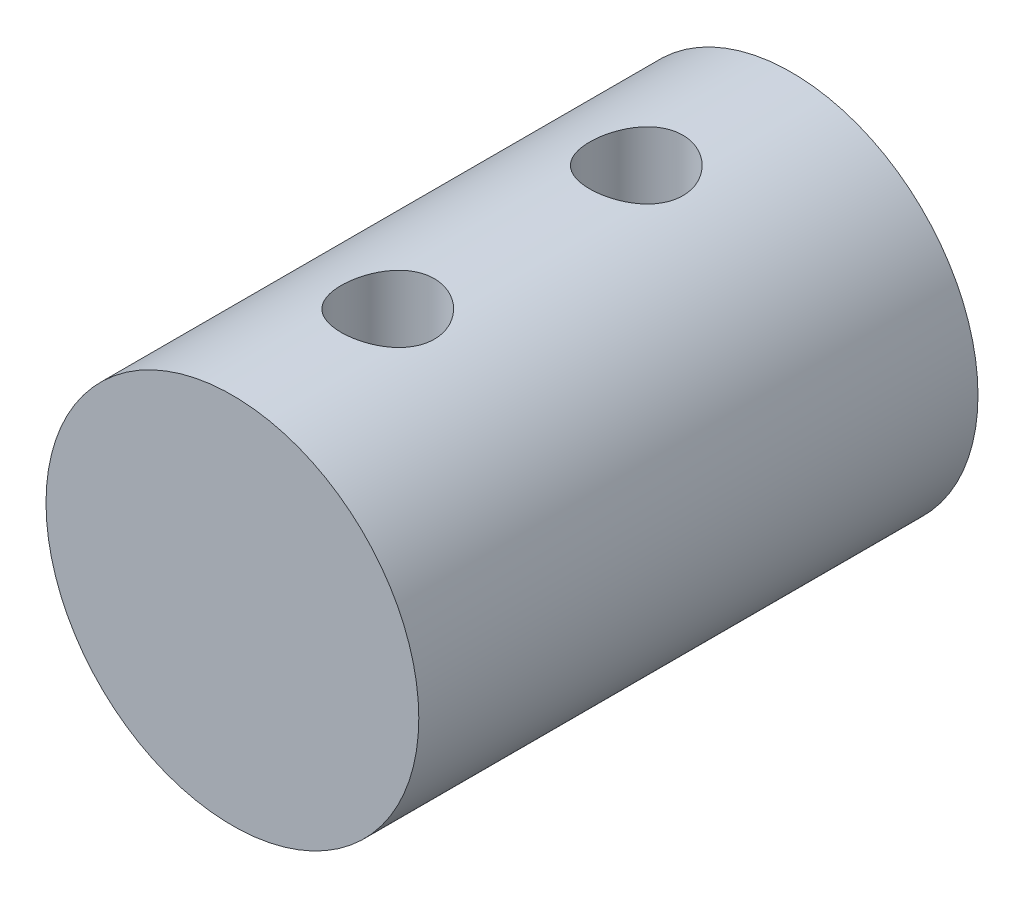
ISO-10303-21;
HEADER;
FILE_DESCRIPTION(('STEP AP214'),'2;1');
FILE_NAME('part.step','',(''),(''),'','','');
FILE_SCHEMA(('AUTOMOTIVE_DESIGN { 1 0 10303 214 1 1 1 1 }'));
ENDSEC;
DATA;
#1=APPLICATION_CONTEXT('core data for automotive mechanical design processes');
#2=APPLICATION_PROTOCOL_DEFINITION('international standard','automotive_design',2000,#1);
#3=PRODUCT_CONTEXT('',#1,'mechanical');
#4=PRODUCT('Part','Part','',(#3));
#5=PRODUCT_RELATED_PRODUCT_CATEGORY('part','',(#4));
#6=PRODUCT_DEFINITION_FORMATION('','',#4);
#7=PRODUCT_DEFINITION_CONTEXT('part definition',#1,'design');
#8=PRODUCT_DEFINITION('design','',#6,#7);
#9=PRODUCT_DEFINITION_SHAPE('','',#8);
#10=(LENGTH_UNIT() NAMED_UNIT(*) SI_UNIT(.MILLI.,.METRE.));
#11=(NAMED_UNIT(*) PLANE_ANGLE_UNIT() SI_UNIT($,.RADIAN.));
#12=(NAMED_UNIT(*) SI_UNIT($,.STERADIAN.) SOLID_ANGLE_UNIT());
#13=UNCERTAINTY_MEASURE_WITH_UNIT(LENGTH_MEASURE(1.E-05),#10,'distance_accuracy_value','');
#14=(GEOMETRIC_REPRESENTATION_CONTEXT(3) GLOBAL_UNCERTAINTY_ASSIGNED_CONTEXT((#13)) GLOBAL_UNIT_ASSIGNED_CONTEXT((#10,
#11,#12)) REPRESENTATION_CONTEXT('',''));
#15=CARTESIAN_POINT('',(0.,0.,0.));
#16=DIRECTION('',(0.,0.,1.));
#17=DIRECTION('',(1.,0.,0.));
#18=AXIS2_PLACEMENT_3D('',#15,#16,#17);
#19=CARTESIAN_POINT('',(0.,0.,18.));
#20=DIRECTION('',(0.,0.,-1.));
#21=DIRECTION('',(-1.,0.,0.));
#22=AXIS2_PLACEMENT_3D('',#19,#20,#21);
#23=CYLINDRICAL_SURFACE('',#22,6.);
#24=CARTESIAN_POINT('',(0.,-6.,14.5));
#25=CARTESIAN_POINT('',(0.0828760886697311,-5.99999859868013,14.4999976742618));
#26=CARTESIAN_POINT('',(0.165778157830763,-5.99826578131828,14.4931084492262));
#27=CARTESIAN_POINT('',(0.329206323770533,-5.99152113829892,14.465774848693));
#28=CARTESIAN_POINT('',(0.409731046870739,-5.98650745419968,14.4453227904621));
#29=CARTESIAN_POINT('',(0.566020872182577,-5.9737562633204,14.3915607465379));
#30=CARTESIAN_POINT('',(0.641791563430003,-5.96602202842087,14.3582662012847));
#31=CARTESIAN_POINT('',(0.786672131904427,-5.94865343807593,14.2798186099552));
#32=CARTESIAN_POINT('',(0.855781784348759,-5.9390190185405,14.2346651638811));
#33=CARTESIAN_POINT('',(0.98680192730092,-5.91867413591801,14.1327992103458));
#34=CARTESIAN_POINT('',(1.04855569006107,-5.90794707148533,14.0758884250408));
#35=CARTESIAN_POINT('',(1.1617489272033,-5.88673620117529,13.9525477950911));
#36=CARTESIAN_POINT('',(1.21318723694914,-5.87625242288348,13.8861168770535));
#37=CARTESIAN_POINT('',(1.30502654279903,-5.8565477569971,13.7444047732626));
#38=CARTESIAN_POINT('',(1.34525221592536,-5.84734794470605,13.6690067691896));
#39=CARTESIAN_POINT('',(1.41239690855053,-5.83149494812223,13.5122515883416));
#40=CARTESIAN_POINT('',(1.43931805543933,-5.82484135672789,13.4308953666742));
#41=CARTESIAN_POINT('',(1.47855483680429,-5.81500476717551,13.2662565017975));
#42=CARTESIAN_POINT('',(1.49115226833334,-5.81175491075426,13.1830451039502));
#43=CARTESIAN_POINT('',(1.50226177506785,-5.80889362537741,13.015631430986));
#44=CARTESIAN_POINT('',(1.50077614181798,-5.80928160448644,12.9314293193014));
#45=CARTESIAN_POINT('',(1.48398652463928,-5.81359205496618,12.7665841922555));
#46=CARTESIAN_POINT('',(1.46901834019052,-5.81742863001879,12.6859043785349));
#47=CARTESIAN_POINT('',(1.42622418690311,-5.82806709676483,12.5282389490887));
#48=CARTESIAN_POINT('',(1.39839730206942,-5.83486919970696,12.451253596971));
#49=CARTESIAN_POINT('',(1.33038947793715,-5.85075113904186,12.3022619837479));
#50=CARTESIAN_POINT('',(1.29008666723291,-5.85985327469421,12.2303138282104));
#51=CARTESIAN_POINT('',(1.19835627601495,-5.87929710846386,12.0940812902432));
#52=CARTESIAN_POINT('',(1.14692674880884,-5.88963902334735,12.0297982519327));
#53=CARTESIAN_POINT('',(1.03266342468122,-5.91075880539781,11.9087963843056));
#54=CARTESIAN_POINT('',(0.969546258165859,-5.92154069477971,11.8523455099386));
#55=CARTESIAN_POINT('',(0.8346119175037,-5.94205965578786,11.7507787575361));
#56=CARTESIAN_POINT('',(0.762794477707943,-5.95179669549415,11.7056632257364));
#57=CARTESIAN_POINT('',(0.612115888681391,-5.96917732094182,11.6279494137756));
#58=CARTESIAN_POINT('',(0.533231393208623,-5.97681360127725,11.5953946597456));
#59=CARTESIAN_POINT('',(0.370876008142882,-5.98907916991418,11.5440826942904));
#60=CARTESIAN_POINT('',(0.287405999150484,-5.99370903339281,11.5253228435819));
#61=CARTESIAN_POINT('',(0.120539970390026,-5.99935499271374,11.5025424344412));
#62=CARTESIAN_POINT('',(0.0371967199882093,-6.00046053508279,11.4981569739247));
#63=CARTESIAN_POINT('',(-0.129032874801509,-5.99918804814451,11.5032490020555));
#64=CARTESIAN_POINT('',(-0.211919259644595,-5.99681033241846,11.5127252427991));
#65=CARTESIAN_POINT('',(-0.373614268776492,-5.98889581127357,11.5449709083914));
#66=CARTESIAN_POINT('',(-0.452465118968754,-5.98340634185811,11.567541263477));
#67=CARTESIAN_POINT('',(-0.605257292452511,-5.96988706634134,11.6251070840284));
#68=CARTESIAN_POINT('',(-0.679198119032635,-5.96185700369892,11.6601038043132));
#69=CARTESIAN_POINT('',(-0.821523134429848,-5.9439330792631,11.7422361288747));
#70=CARTESIAN_POINT('',(-0.889785441835831,-5.93400867366932,11.7895761123968));
#71=CARTESIAN_POINT('',(-1.01752661364325,-5.91344509187419,11.894789908797));
#72=CARTESIAN_POINT('',(-1.07700395897301,-5.90280579251705,11.9526655396169));
#73=CARTESIAN_POINT('',(-1.18699056807273,-5.88168956960771,12.0790019608445));
#74=CARTESIAN_POINT('',(-1.23724386762203,-5.87122304187281,12.1476877030024));
#75=CARTESIAN_POINT('',(-1.3255107590127,-5.85192878377239,12.2927326344657));
#76=CARTESIAN_POINT('',(-1.36352489415794,-5.84310098067026,12.3690914829598));
#77=CARTESIAN_POINT('',(-1.42595142060929,-5.82818094734665,12.5269057224131));
#78=CARTESIAN_POINT('',(-1.45044439665407,-5.82207255291905,12.608327628344));
#79=CARTESIAN_POINT('',(-1.48534565995378,-5.81326744090183,12.7743096378891));
#80=CARTESIAN_POINT('',(-1.49575702747866,-5.81056997719936,12.8588690510325));
#81=CARTESIAN_POINT('',(-1.50203859033399,-5.80894901203957,13.0261210238552));
#82=CARTESIAN_POINT('',(-1.49831789778012,-5.80991932728264,13.1087974351247));
#83=CARTESIAN_POINT('',(-1.47737727831287,-5.81527909007843,13.272303888668));
#84=CARTESIAN_POINT('',(-1.46015762268677,-5.81966846891857,13.3531339680136));
#85=CARTESIAN_POINT('',(-1.41293131944279,-5.83131260682722,13.5102084590654));
#86=CARTESIAN_POINT('',(-1.38300140468038,-5.83855015236309,13.5864773052402));
#87=CARTESIAN_POINT('',(-1.31126491360507,-5.85507755724829,13.7329653827137));
#88=CARTESIAN_POINT('',(-1.26945669003419,-5.86436770120773,13.8031837731869));
#89=CARTESIAN_POINT('',(-1.17386774863714,-5.88425634263512,13.937554629002));
#90=CARTESIAN_POINT('',(-1.11980316291225,-5.89488264831757,14.001501073424));
#91=CARTESIAN_POINT('',(-1.00178937118973,-5.91608027246286,14.1195470447954));
#92=CARTESIAN_POINT('',(-0.937837821261145,-5.9266515772706,14.173644230113));
#93=CARTESIAN_POINT('',(-0.800467586702589,-5.94677655647663,14.2714113085646));
#94=CARTESIAN_POINT('',(-0.726898422316386,-5.95630833365868,14.3148746136716));
#95=CARTESIAN_POINT('',(-0.573266059510475,-5.97304924975118,14.3887474629405));
#96=CARTESIAN_POINT('',(-0.493207563436738,-5.98026005199781,14.4191663606485));
#97=CARTESIAN_POINT('',(-0.344410253243471,-5.99048059565541,14.4615718303297));
#98=CARTESIAN_POINT('',(-0.276380170908068,-5.9940258505269,14.4759512430534));
#99=CARTESIAN_POINT('',(-0.138906071536283,-5.99878605231948,14.4951659436219));
#100=CARTESIAN_POINT('',(-0.0694621612426162,-6.00000117450894,14.5000019493053));
#101=CARTESIAN_POINT('',(0.,-6.,14.5));
#102=B_SPLINE_CURVE_WITH_KNOTS('',3,(#24,#25,#26,#27,#28,#29,#30,#31,#32,#33,#34,#35,#36,#37,
#38,#39,#40,#41,#42,#43,#44,#45,#46,#47,#48,#49,#50,#51,#52,#53,#54,#55,#56,#57,#58,#59,#60,#61,
#62,#63,#64,#65,#66,#67,#68,#69,#70,#71,#72,#73,#74,#75,#76,#77,#78,#79,#80,#81,#82,#83,#84,#85,
#86,#87,#88,#89,#90,#91,#92,#93,#94,#95,#96,#97,#98,#99,#100,#101),.UNSPECIFIED.,.T.,.F.,(4,2,2,
2,2,2,2,2,2,2,2,2,2,2,2,2,2,2,2,2,2,2,2,2,2,2,2,2,2,2,2,2,2,2,2,2,2,2,4),(0.,0.24837371247189,
0.4968882377639,0.745104902286106,0.993329940169328,1.24614435437139,1.49898729580062,
1.75558647545807,2.01214461169368,2.26356295099431,2.51494038112697,2.76022497007018,
3.00552703466038,3.25330527873879,3.50112690836163,3.75601500969019,4.01091089558247,
4.26668229009114,4.52240473688643,4.77158308949276,5.02073901112743,5.26620274514037,
5.51169127322291,5.76153587565352,6.01142363008019,6.26744509204476,6.52345518749508,
6.77792254614037,7.03233423252408,7.27943780398612,7.52653640956034,7.77216400559447,
8.01782568136902,8.26989576409911,8.52202569770418,8.77872185499588,9.0352336382135,
9.24342242942149,9.4515955604304),.UNSPECIFIED.);
#103=CARTESIAN_POINT('',(0.,-6.,14.5));
#104=VERTEX_POINT('',#103);
#105=EDGE_CURVE('E10',#104,#104,#102,.T.);
#106=ORIENTED_EDGE('',*,*,#105,.T.);
#107=EDGE_LOOP('',(#106));
#108=FACE_BOUND('',#107,.T.);
#109=CARTESIAN_POINT('',(0.,6.,14.5));
#110=CARTESIAN_POINT('',(-0.0828760886697311,5.99999859868013,14.4999976742618));
#111=CARTESIAN_POINT('',(-0.165778157830763,5.99826578131828,14.4931084492262));
#112=CARTESIAN_POINT('',(-0.329206323770533,5.99152113829892,14.465774848693));
#113=CARTESIAN_POINT('',(-0.409731046870739,5.98650745419968,14.4453227904621));
#114=CARTESIAN_POINT('',(-0.566020872182577,5.9737562633204,14.3915607465379));
#115=CARTESIAN_POINT('',(-0.641791563430003,5.96602202842087,14.3582662012847));
#116=CARTESIAN_POINT('',(-0.786672131904427,5.94865343807593,14.2798186099552));
#117=CARTESIAN_POINT('',(-0.855781784348759,5.9390190185405,14.2346651638811));
#118=CARTESIAN_POINT('',(-0.98680192730092,5.91867413591801,14.1327992103458));
#119=CARTESIAN_POINT('',(-1.04855569006107,5.90794707148533,14.0758884250408));
#120=CARTESIAN_POINT('',(-1.1617489272033,5.88673620117529,13.9525477950911));
#121=CARTESIAN_POINT('',(-1.21318723694914,5.87625242288348,13.8861168770535));
#122=CARTESIAN_POINT('',(-1.30502654279903,5.8565477569971,13.7444047732626));
#123=CARTESIAN_POINT('',(-1.34525221592536,5.84734794470605,13.6690067691896));
#124=CARTESIAN_POINT('',(-1.41239690855053,5.83149494812223,13.5122515883416));
#125=CARTESIAN_POINT('',(-1.43931805543933,5.82484135672789,13.4308953666742));
#126=CARTESIAN_POINT('',(-1.47855483680429,5.81500476717551,13.2662565017975));
#127=CARTESIAN_POINT('',(-1.49115226833334,5.81175491075426,13.1830451039502));
#128=CARTESIAN_POINT('',(-1.50226177506785,5.80889362537741,13.015631430986));
#129=CARTESIAN_POINT('',(-1.50077614181798,5.80928160448644,12.9314293193014));
#130=CARTESIAN_POINT('',(-1.48398652463928,5.81359205496618,12.7665841922555));
#131=CARTESIAN_POINT('',(-1.46901834019052,5.81742863001879,12.6859043785349));
#132=CARTESIAN_POINT('',(-1.42622418690311,5.82806709676483,12.5282389490887));
#133=CARTESIAN_POINT('',(-1.39839730206942,5.83486919970696,12.451253596971));
#134=CARTESIAN_POINT('',(-1.33038947793715,5.85075113904186,12.3022619837479));
#135=CARTESIAN_POINT('',(-1.29008666723291,5.85985327469421,12.2303138282104));
#136=CARTESIAN_POINT('',(-1.19835627601495,5.87929710846386,12.0940812902432));
#137=CARTESIAN_POINT('',(-1.14692674880884,5.88963902334735,12.0297982519327));
#138=CARTESIAN_POINT('',(-1.03266342468122,5.91075880539781,11.9087963843056));
#139=CARTESIAN_POINT('',(-0.969546258165859,5.92154069477971,11.8523455099386));
#140=CARTESIAN_POINT('',(-0.8346119175037,5.94205965578786,11.7507787575361));
#141=CARTESIAN_POINT('',(-0.762794477707943,5.95179669549415,11.7056632257364));
#142=CARTESIAN_POINT('',(-0.612115888681391,5.96917732094182,11.6279494137756));
#143=CARTESIAN_POINT('',(-0.533231393208623,5.97681360127725,11.5953946597456));
#144=CARTESIAN_POINT('',(-0.370876008142882,5.98907916991418,11.5440826942904));
#145=CARTESIAN_POINT('',(-0.287405999150484,5.99370903339281,11.5253228435819));
#146=CARTESIAN_POINT('',(-0.120539970390026,5.99935499271374,11.5025424344412));
#147=CARTESIAN_POINT('',(-0.0371967199882093,6.00046053508279,11.4981569739247));
#148=CARTESIAN_POINT('',(0.129032874801509,5.99918804814451,11.5032490020555));
#149=CARTESIAN_POINT('',(0.211919259644595,5.99681033241846,11.5127252427991));
#150=CARTESIAN_POINT('',(0.373614268776492,5.98889581127357,11.5449709083914));
#151=CARTESIAN_POINT('',(0.452465118968754,5.98340634185811,11.567541263477));
#152=CARTESIAN_POINT('',(0.605257292452511,5.96988706634134,11.6251070840284));
#153=CARTESIAN_POINT('',(0.679198119032635,5.96185700369892,11.6601038043132));
#154=CARTESIAN_POINT('',(0.821523134429848,5.9439330792631,11.7422361288747));
#155=CARTESIAN_POINT('',(0.889785441835831,5.93400867366932,11.7895761123968));
#156=CARTESIAN_POINT('',(1.01752661364325,5.91344509187419,11.894789908797));
#157=CARTESIAN_POINT('',(1.07700395897301,5.90280579251705,11.9526655396169));
#158=CARTESIAN_POINT('',(1.18699056807273,5.88168956960771,12.0790019608445));
#159=CARTESIAN_POINT('',(1.23724386762203,5.87122304187281,12.1476877030024));
#160=CARTESIAN_POINT('',(1.3255107590127,5.85192878377239,12.2927326344657));
#161=CARTESIAN_POINT('',(1.36352489415794,5.84310098067026,12.3690914829598));
#162=CARTESIAN_POINT('',(1.42595142060929,5.82818094734665,12.5269057224131));
#163=CARTESIAN_POINT('',(1.45044439665407,5.82207255291905,12.608327628344));
#164=CARTESIAN_POINT('',(1.48534565995378,5.81326744090183,12.7743096378891));
#165=CARTESIAN_POINT('',(1.49575702747866,5.81056997719936,12.8588690510325));
#166=CARTESIAN_POINT('',(1.50203859033399,5.80894901203957,13.0261210238552));
#167=CARTESIAN_POINT('',(1.49831789778012,5.80991932728264,13.1087974351247));
#168=CARTESIAN_POINT('',(1.47737727831287,5.81527909007843,13.272303888668));
#169=CARTESIAN_POINT('',(1.46015762268677,5.81966846891857,13.3531339680136));
#170=CARTESIAN_POINT('',(1.41293131944279,5.83131260682722,13.5102084590654));
#171=CARTESIAN_POINT('',(1.38300140468038,5.83855015236309,13.5864773052402));
#172=CARTESIAN_POINT('',(1.31126491360507,5.85507755724829,13.7329653827137));
#173=CARTESIAN_POINT('',(1.26945669003419,5.86436770120773,13.8031837731869));
#174=CARTESIAN_POINT('',(1.17386774863714,5.88425634263512,13.937554629002));
#175=CARTESIAN_POINT('',(1.11980316291225,5.89488264831757,14.001501073424));
#176=CARTESIAN_POINT('',(1.00178937118973,5.91608027246286,14.1195470447954));
#177=CARTESIAN_POINT('',(0.937837821261145,5.9266515772706,14.173644230113));
#178=CARTESIAN_POINT('',(0.800467586702589,5.94677655647663,14.2714113085646));
#179=CARTESIAN_POINT('',(0.726898422316386,5.95630833365868,14.3148746136716));
#180=CARTESIAN_POINT('',(0.573266059510475,5.97304924975118,14.3887474629405));
#181=CARTESIAN_POINT('',(0.493207563436738,5.98026005199781,14.4191663606485));
#182=CARTESIAN_POINT('',(0.344410253243471,5.99048059565541,14.4615718303297));
#183=CARTESIAN_POINT('',(0.276380170908068,5.9940258505269,14.4759512430534));
#184=CARTESIAN_POINT('',(0.138906071536283,5.99878605231948,14.4951659436219));
#185=CARTESIAN_POINT('',(0.0694621612426162,6.00000117450894,14.5000019493053));
#186=CARTESIAN_POINT('',(0.,6.,14.5));
#187=B_SPLINE_CURVE_WITH_KNOTS('',3,(#109,#110,#111,#112,#113,#114,#115,#116,#117,#118,#119,
#120,#121,#122,#123,#124,#125,#126,#127,#128,#129,#130,#131,#132,#133,#134,#135,#136,#137,#138,
#139,#140,#141,#142,#143,#144,#145,#146,#147,#148,#149,#150,#151,#152,#153,#154,#155,#156,#157,
#158,#159,#160,#161,#162,#163,#164,#165,#166,#167,#168,#169,#170,#171,#172,#173,#174,#175,#176,
#177,#178,#179,#180,#181,#182,#183,#184,#185,#186),.UNSPECIFIED.,.T.,.F.,(4,2,2,2,2,2,2,2,2,2,2,
2,2,2,2,2,2,2,2,2,2,2,2,2,2,2,2,2,2,2,2,2,2,2,2,2,2,2,4),(0.,0.24837371247189,0.4968882377639,
0.745104902286106,0.993329940169328,1.24614435437139,1.49898729580062,1.75558647545807,
2.01214461169368,2.26356295099431,2.51494038112697,2.76022497007018,3.00552703466038,
3.25330527873879,3.50112690836163,3.75601500969019,4.01091089558247,4.26668229009114,
4.52240473688643,4.77158308949276,5.02073901112743,5.26620274514037,5.51169127322291,
5.76153587565352,6.01142363008019,6.26744509204476,6.52345518749508,6.77792254614037,
7.03233423252408,7.27943780398612,7.52653640956034,7.77216400559447,8.01782568136902,
8.26989576409911,8.52202569770418,8.77872185499588,9.0352336382135,9.24342242942149,
9.4515955604304),.UNSPECIFIED.);
#188=CARTESIAN_POINT('',(0.,6.,14.5));
#189=VERTEX_POINT('',#188);
#190=EDGE_CURVE('E42',#189,#189,#187,.T.);
#191=ORIENTED_EDGE('',*,*,#190,.T.);
#192=EDGE_LOOP('',(#191));
#193=FACE_BOUND('',#192,.T.);
#194=CARTESIAN_POINT('',(0.,-6.,6.5));
#195=CARTESIAN_POINT('',(0.0828760886697311,-5.99999859868013,6.49999767426184));
#196=CARTESIAN_POINT('',(0.165778157830763,-5.99826578131828,6.49310844922621));
#197=CARTESIAN_POINT('',(0.329206323770533,-5.99152113829892,6.465774848693));
#198=CARTESIAN_POINT('',(0.409731046870739,-5.98650745419968,6.44532279046215));
#199=CARTESIAN_POINT('',(0.566020872182577,-5.9737562633204,6.39156074653791));
#200=CARTESIAN_POINT('',(0.641791563430003,-5.96602202842087,6.35826620128472));
#201=CARTESIAN_POINT('',(0.786672131904427,-5.94865343807593,6.27981860995517));
#202=CARTESIAN_POINT('',(0.855781784348759,-5.9390190185405,6.23466516388106));
#203=CARTESIAN_POINT('',(0.98680192730092,-5.91867413591801,6.13279921034579));
#204=CARTESIAN_POINT('',(1.04855569006107,-5.90794707148533,6.07588842504082));
#205=CARTESIAN_POINT('',(1.1617489272033,-5.88673620117529,5.95254779509108));
#206=CARTESIAN_POINT('',(1.21318723694913,-5.87625242288348,5.8861168770535));
#207=CARTESIAN_POINT('',(1.30502654279903,-5.8565477569971,5.74440477326256));
#208=CARTESIAN_POINT('',(1.34525221592536,-5.84734794470605,5.6690067691896));
#209=CARTESIAN_POINT('',(1.41239690855053,-5.83149494812223,5.51225158834164));
#210=CARTESIAN_POINT('',(1.43931805543933,-5.82484135672789,5.43089536667424));
#211=CARTESIAN_POINT('',(1.47855483680429,-5.81500476717551,5.26625650179753));
#212=CARTESIAN_POINT('',(1.49115226833334,-5.81175491075426,5.1830451039502));
#213=CARTESIAN_POINT('',(1.50226177506785,-5.80889362537741,5.01563143098602));
#214=CARTESIAN_POINT('',(1.50077614181798,-5.80928160448644,4.93142931930139));
#215=CARTESIAN_POINT('',(1.48398652463928,-5.81359205496618,4.76658419225552));
#216=CARTESIAN_POINT('',(1.46901834019052,-5.81742863001879,4.6859043785349));
#217=CARTESIAN_POINT('',(1.42622418690311,-5.82806709676483,4.52823894908871));
#218=CARTESIAN_POINT('',(1.39839730206942,-5.83486919970696,4.45125359697102));
#219=CARTESIAN_POINT('',(1.33038947793715,-5.85075113904186,4.30226198374793));
#220=CARTESIAN_POINT('',(1.29008666723291,-5.85985327469421,4.23031382821045));
#221=CARTESIAN_POINT('',(1.19835627601495,-5.87929710846386,4.09408129024316));
#222=CARTESIAN_POINT('',(1.14692674880884,-5.88963902334735,4.02979825193274));
#223=CARTESIAN_POINT('',(1.03266342468122,-5.91075880539781,3.9087963843056));
#224=CARTESIAN_POINT('',(0.96954625816586,-5.92154069477971,3.85234550993865));
#225=CARTESIAN_POINT('',(0.8346119175037,-5.94205965578786,3.7507787575361));
#226=CARTESIAN_POINT('',(0.762794477707944,-5.95179669549415,3.70566322573643));
#227=CARTESIAN_POINT('',(0.612115888681392,-5.96917732094182,3.62794941377561));
#228=CARTESIAN_POINT('',(0.533231393208624,-5.97681360127725,3.59539465974557));
#229=CARTESIAN_POINT('',(0.370876008142883,-5.98907916991418,3.54408269429043));
#230=CARTESIAN_POINT('',(0.287405999150485,-5.99370903339281,3.52532284358186));
#231=CARTESIAN_POINT('',(0.120539970390028,-5.99935499271374,3.50254243444116));
#232=CARTESIAN_POINT('',(0.0371967199882108,-6.00046053508279,3.4981569739247));
#233=CARTESIAN_POINT('',(-0.129032874801507,-5.99918804814451,3.50324900205549));
#234=CARTESIAN_POINT('',(-0.211919259644594,-5.99681033241846,3.51272524279913));
#235=CARTESIAN_POINT('',(-0.373614268776491,-5.98889581127357,3.54497090839138));
#236=CARTESIAN_POINT('',(-0.452465118968754,-5.98340634185811,3.56754126347699));
#237=CARTESIAN_POINT('',(-0.60525729245251,-5.96988706634134,3.62510708402845));
#238=CARTESIAN_POINT('',(-0.679198119032634,-5.96185700369892,3.66010380431317));
#239=CARTESIAN_POINT('',(-0.821523134429847,-5.9439330792631,3.74223612887473));
#240=CARTESIAN_POINT('',(-0.88978544183583,-5.93400867366932,3.78957611239676));
#241=CARTESIAN_POINT('',(-1.01752661364325,-5.91344509187419,3.89478990879697));
#242=CARTESIAN_POINT('',(-1.07700395897301,-5.90280579251705,3.95266553961691));
#243=CARTESIAN_POINT('',(-1.18699056807273,-5.88168956960771,4.07900196084446));
#244=CARTESIAN_POINT('',(-1.23724386762203,-5.87122304187281,4.14768770300242));
#245=CARTESIAN_POINT('',(-1.3255107590127,-5.85192878377239,4.29273263446572));
#246=CARTESIAN_POINT('',(-1.36352489415794,-5.84310098067026,4.36909148295975));
#247=CARTESIAN_POINT('',(-1.42595142060929,-5.82818094734665,4.52690572241308));
#248=CARTESIAN_POINT('',(-1.45044439665406,-5.82207255291905,4.60832762834401));
#249=CARTESIAN_POINT('',(-1.48534565995378,-5.81326744090183,4.77430963788911));
#250=CARTESIAN_POINT('',(-1.49575702747866,-5.81056997719936,4.85886905103249));
#251=CARTESIAN_POINT('',(-1.50203859033399,-5.80894901203957,5.0261210238552));
#252=CARTESIAN_POINT('',(-1.49831789778012,-5.80991932728264,5.10879743512473));
#253=CARTESIAN_POINT('',(-1.47737727831287,-5.81527909007843,5.27230388866798));
#254=CARTESIAN_POINT('',(-1.46015762268677,-5.81966846891857,5.35313396801365));
#255=CARTESIAN_POINT('',(-1.41293131944279,-5.83131260682722,5.51020845906541));
#256=CARTESIAN_POINT('',(-1.38300140468038,-5.83855015236309,5.58647730524021));
#257=CARTESIAN_POINT('',(-1.31126491360507,-5.85507755724829,5.73296538271369));
#258=CARTESIAN_POINT('',(-1.26945669003419,-5.86436770120773,5.80318377318692));
#259=CARTESIAN_POINT('',(-1.17386774863714,-5.88425634263512,5.93755462900202));
#260=CARTESIAN_POINT('',(-1.11980316291225,-5.89488264831757,6.00150107342396));
#261=CARTESIAN_POINT('',(-1.00178937118974,-5.91608027246286,6.11954704479541));
#262=CARTESIAN_POINT('',(-0.937837821261146,-5.9266515772706,6.17364423011297));
#263=CARTESIAN_POINT('',(-0.80046758670259,-5.94677655647663,6.27141130856461));
#264=CARTESIAN_POINT('',(-0.726898422316386,-5.95630833365868,6.31487461367158));
#265=CARTESIAN_POINT('',(-0.573266059510476,-5.97304924975118,6.38874746294053));
#266=CARTESIAN_POINT('',(-0.493207563436739,-5.98026005199781,6.41916636064854));
#267=CARTESIAN_POINT('',(-0.344410253243472,-5.99048059565541,6.46157183032965));
#268=CARTESIAN_POINT('',(-0.276380170908068,-5.9940258505269,6.47595124305343));
#269=CARTESIAN_POINT('',(-0.138906071536283,-5.99878605231948,6.49516594362194));
#270=CARTESIAN_POINT('',(-0.0694621612426162,-6.00000117450894,6.5000019493053));
#271=CARTESIAN_POINT('',(0.,-6.,6.5));
#272=B_SPLINE_CURVE_WITH_KNOTS('',3,(#194,#195,#196,#197,#198,#199,#200,#201,#202,#203,#204,
#205,#206,#207,#208,#209,#210,#211,#212,#213,#214,#215,#216,#217,#218,#219,#220,#221,#222,#223,
#224,#225,#226,#227,#228,#229,#230,#231,#232,#233,#234,#235,#236,#237,#238,#239,#240,#241,#242,
#243,#244,#245,#246,#247,#248,#249,#250,#251,#252,#253,#254,#255,#256,#257,#258,#259,#260,#261,
#262,#263,#264,#265,#266,#267,#268,#269,#270,#271),.UNSPECIFIED.,.T.,.F.,(4,2,2,2,2,2,2,2,2,2,2,
2,2,2,2,2,2,2,2,2,2,2,2,2,2,2,2,2,2,2,2,2,2,2,2,2,2,2,4),(0.,0.24837371247189,0.4968882377639,
0.745104902286106,0.993329940169328,1.24614435437139,1.49898729580062,1.75558647545807,
2.01214461169368,2.2635629509943,2.51494038112697,2.76022497007018,3.00552703466038,
3.25330527873879,3.50112690836163,3.75601500969019,4.01091089558247,4.26668229009114,
4.52240473688643,4.77158308949276,5.02073901112743,5.26620274514037,5.5116912732229,
5.76153587565352,6.01142363008019,6.26744509204476,6.52345518749508,6.77792254614036,
7.03233423252408,7.27943780398612,7.52653640956034,7.77216400559447,8.01782568136901,
8.2698957640991,8.52202569770418,8.77872185499588,9.0352336382135,9.24342242942149,
9.4515955604304),.UNSPECIFIED.);
#273=CARTESIAN_POINT('',(0.,-6.,6.5));
#274=VERTEX_POINT('',#273);
#275=EDGE_CURVE('E46',#274,#274,#272,.T.);
#276=ORIENTED_EDGE('',*,*,#275,.T.);
#277=EDGE_LOOP('',(#276));
#278=FACE_BOUND('',#277,.T.);
#279=CARTESIAN_POINT('',(0.,6.,6.5));
#280=CARTESIAN_POINT('',(-0.0828760886697311,5.99999859868013,6.49999767426184));
#281=CARTESIAN_POINT('',(-0.165778157830763,5.99826578131828,6.49310844922621));
#282=CARTESIAN_POINT('',(-0.329206323770533,5.99152113829892,6.465774848693));
#283=CARTESIAN_POINT('',(-0.409731046870739,5.98650745419968,6.44532279046215));
#284=CARTESIAN_POINT('',(-0.566020872182577,5.9737562633204,6.39156074653791));
#285=CARTESIAN_POINT('',(-0.641791563430003,5.96602202842087,6.35826620128472));
#286=CARTESIAN_POINT('',(-0.786672131904427,5.94865343807593,6.27981860995517));
#287=CARTESIAN_POINT('',(-0.855781784348759,5.9390190185405,6.23466516388106));
#288=CARTESIAN_POINT('',(-0.98680192730092,5.91867413591801,6.13279921034579));
#289=CARTESIAN_POINT('',(-1.04855569006107,5.90794707148533,6.07588842504082));
#290=CARTESIAN_POINT('',(-1.1617489272033,5.88673620117529,5.95254779509108));
#291=CARTESIAN_POINT('',(-1.21318723694913,5.87625242288348,5.8861168770535));
#292=CARTESIAN_POINT('',(-1.30502654279903,5.8565477569971,5.74440477326256));
#293=CARTESIAN_POINT('',(-1.34525221592536,5.84734794470605,5.6690067691896));
#294=CARTESIAN_POINT('',(-1.41239690855053,5.83149494812223,5.51225158834164));
#295=CARTESIAN_POINT('',(-1.43931805543933,5.82484135672789,5.43089536667424));
#296=CARTESIAN_POINT('',(-1.47855483680429,5.81500476717551,5.26625650179753));
#297=CARTESIAN_POINT('',(-1.49115226833334,5.81175491075426,5.1830451039502));
#298=CARTESIAN_POINT('',(-1.50226177506785,5.80889362537741,5.01563143098602));
#299=CARTESIAN_POINT('',(-1.50077614181798,5.80928160448644,4.93142931930139));
#300=CARTESIAN_POINT('',(-1.48398652463928,5.81359205496618,4.76658419225552));
#301=CARTESIAN_POINT('',(-1.46901834019052,5.81742863001879,4.6859043785349));
#302=CARTESIAN_POINT('',(-1.42622418690311,5.82806709676483,4.52823894908871));
#303=CARTESIAN_POINT('',(-1.39839730206942,5.83486919970696,4.45125359697102));
#304=CARTESIAN_POINT('',(-1.33038947793715,5.85075113904186,4.30226198374793));
#305=CARTESIAN_POINT('',(-1.29008666723291,5.85985327469421,4.23031382821045));
#306=CARTESIAN_POINT('',(-1.19835627601495,5.87929710846386,4.09408129024316));
#307=CARTESIAN_POINT('',(-1.14692674880884,5.88963902334735,4.02979825193274));
#308=CARTESIAN_POINT('',(-1.03266342468122,5.91075880539781,3.9087963843056));
#309=CARTESIAN_POINT('',(-0.96954625816586,5.92154069477971,3.85234550993865));
#310=CARTESIAN_POINT('',(-0.8346119175037,5.94205965578786,3.7507787575361));
#311=CARTESIAN_POINT('',(-0.762794477707944,5.95179669549415,3.70566322573643));
#312=CARTESIAN_POINT('',(-0.612115888681392,5.96917732094182,3.62794941377561));
#313=CARTESIAN_POINT('',(-0.533231393208624,5.97681360127725,3.59539465974557));
#314=CARTESIAN_POINT('',(-0.370876008142883,5.98907916991418,3.54408269429043));
#315=CARTESIAN_POINT('',(-0.287405999150485,5.99370903339281,3.52532284358186));
#316=CARTESIAN_POINT('',(-0.120539970390028,5.99935499271374,3.50254243444116));
#317=CARTESIAN_POINT('',(-0.0371967199882108,6.00046053508279,3.4981569739247));
#318=CARTESIAN_POINT('',(0.129032874801507,5.99918804814451,3.50324900205549));
#319=CARTESIAN_POINT('',(0.211919259644594,5.99681033241846,3.51272524279913));
#320=CARTESIAN_POINT('',(0.373614268776491,5.98889581127357,3.54497090839138));
#321=CARTESIAN_POINT('',(0.452465118968754,5.98340634185811,3.56754126347699));
#322=CARTESIAN_POINT('',(0.60525729245251,5.96988706634134,3.62510708402845));
#323=CARTESIAN_POINT('',(0.679198119032634,5.96185700369892,3.66010380431317));
#324=CARTESIAN_POINT('',(0.821523134429847,5.9439330792631,3.74223612887473));
#325=CARTESIAN_POINT('',(0.88978544183583,5.93400867366932,3.78957611239676));
#326=CARTESIAN_POINT('',(1.01752661364325,5.91344509187419,3.89478990879697));
#327=CARTESIAN_POINT('',(1.07700395897301,5.90280579251705,3.95266553961691));
#328=CARTESIAN_POINT('',(1.18699056807273,5.88168956960771,4.07900196084446));
#329=CARTESIAN_POINT('',(1.23724386762203,5.87122304187281,4.14768770300242));
#330=CARTESIAN_POINT('',(1.3255107590127,5.85192878377239,4.29273263446572));
#331=CARTESIAN_POINT('',(1.36352489415794,5.84310098067026,4.36909148295975));
#332=CARTESIAN_POINT('',(1.42595142060929,5.82818094734665,4.52690572241308));
#333=CARTESIAN_POINT('',(1.45044439665406,5.82207255291905,4.60832762834401));
#334=CARTESIAN_POINT('',(1.48534565995378,5.81326744090183,4.77430963788911));
#335=CARTESIAN_POINT('',(1.49575702747866,5.81056997719936,4.85886905103249));
#336=CARTESIAN_POINT('',(1.50203859033399,5.80894901203957,5.0261210238552));
#337=CARTESIAN_POINT('',(1.49831789778012,5.80991932728264,5.10879743512473));
#338=CARTESIAN_POINT('',(1.47737727831287,5.81527909007843,5.27230388866798));
#339=CARTESIAN_POINT('',(1.46015762268677,5.81966846891857,5.35313396801365));
#340=CARTESIAN_POINT('',(1.41293131944279,5.83131260682722,5.51020845906541));
#341=CARTESIAN_POINT('',(1.38300140468038,5.83855015236309,5.58647730524021));
#342=CARTESIAN_POINT('',(1.31126491360507,5.85507755724829,5.73296538271369));
#343=CARTESIAN_POINT('',(1.26945669003419,5.86436770120773,5.80318377318692));
#344=CARTESIAN_POINT('',(1.17386774863714,5.88425634263512,5.93755462900202));
#345=CARTESIAN_POINT('',(1.11980316291225,5.89488264831757,6.00150107342396));
#346=CARTESIAN_POINT('',(1.00178937118974,5.91608027246286,6.11954704479541));
#347=CARTESIAN_POINT('',(0.937837821261146,5.9266515772706,6.17364423011297));
#348=CARTESIAN_POINT('',(0.80046758670259,5.94677655647663,6.27141130856461));
#349=CARTESIAN_POINT('',(0.726898422316386,5.95630833365868,6.31487461367158));
#350=CARTESIAN_POINT('',(0.573266059510476,5.97304924975118,6.38874746294053));
#351=CARTESIAN_POINT('',(0.493207563436739,5.98026005199781,6.41916636064854));
#352=CARTESIAN_POINT('',(0.344410253243472,5.99048059565541,6.46157183032965));
#353=CARTESIAN_POINT('',(0.276380170908068,5.9940258505269,6.47595124305343));
#354=CARTESIAN_POINT('',(0.138906071536283,5.99878605231948,6.49516594362194));
#355=CARTESIAN_POINT('',(0.0694621612426162,6.00000117450894,6.5000019493053));
#356=CARTESIAN_POINT('',(0.,6.,6.5));
#357=B_SPLINE_CURVE_WITH_KNOTS('',3,(#279,#280,#281,#282,#283,#284,#285,#286,#287,#288,#289,
#290,#291,#292,#293,#294,#295,#296,#297,#298,#299,#300,#301,#302,#303,#304,#305,#306,#307,#308,
#309,#310,#311,#312,#313,#314,#315,#316,#317,#318,#319,#320,#321,#322,#323,#324,#325,#326,#327,
#328,#329,#330,#331,#332,#333,#334,#335,#336,#337,#338,#339,#340,#341,#342,#343,#344,#345,#346,
#347,#348,#349,#350,#351,#352,#353,#354,#355,#356),.UNSPECIFIED.,.T.,.F.,(4,2,2,2,2,2,2,2,2,2,2,
2,2,2,2,2,2,2,2,2,2,2,2,2,2,2,2,2,2,2,2,2,2,2,2,2,2,2,4),(0.,0.24837371247189,0.4968882377639,
0.745104902286106,0.993329940169328,1.24614435437139,1.49898729580062,1.75558647545807,
2.01214461169368,2.2635629509943,2.51494038112697,2.76022497007018,3.00552703466038,
3.25330527873879,3.50112690836163,3.75601500969019,4.01091089558247,4.26668229009114,
4.52240473688643,4.77158308949276,5.02073901112743,5.26620274514037,5.5116912732229,
5.76153587565352,6.01142363008019,6.26744509204476,6.52345518749508,6.77792254614036,
7.03233423252408,7.27943780398612,7.52653640956034,7.77216400559447,8.01782568136901,
8.2698957640991,8.52202569770418,8.77872185499588,9.0352336382135,9.24342242942149,
9.4515955604304),.UNSPECIFIED.);
#358=CARTESIAN_POINT('',(0.,6.,6.5));
#359=VERTEX_POINT('',#358);
#360=EDGE_CURVE('E50',#359,#359,#357,.T.);
#361=ORIENTED_EDGE('',*,*,#360,.T.);
#362=EDGE_LOOP('',(#361));
#363=FACE_BOUND('',#362,.T.);
#364=CARTESIAN_POINT('',(0.,0.,18.));
#365=DIRECTION('',(0.,0.,1.));
#366=DIRECTION('',(1.,0.,0.));
#367=AXIS2_PLACEMENT_3D('',#364,#365,#366);
#368=CIRCLE('',#367,6.);
#369=CARTESIAN_POINT('',(6.,0.,18.));
#370=VERTEX_POINT('',#369);
#371=EDGE_CURVE('E75',#370,#370,#368,.T.);
#372=ORIENTED_EDGE('',*,*,#371,.F.);
#373=EDGE_LOOP('',(#372));
#374=FACE_BOUND('',#373,.T.);
#375=CARTESIAN_POINT('',(0.,0.,0.));
#376=DIRECTION('',(0.,0.,1.));
#377=DIRECTION('',(1.,0.,0.));
#378=AXIS2_PLACEMENT_3D('',#375,#376,#377);
#379=CIRCLE('',#378,6.);
#380=CARTESIAN_POINT('',(6.,0.,0.));
#381=VERTEX_POINT('',#380);
#382=EDGE_CURVE('E76',#381,#381,#379,.T.);
#383=ORIENTED_EDGE('',*,*,#382,.T.);
#384=EDGE_LOOP('',(#383));
#385=FACE_BOUND('',#384,.T.);
#386=ADVANCED_FACE('F32',(#108,#193,#278,#363,#374,#385),#23,.T.);
#387=CARTESIAN_POINT('',(0.,0.,18.));
#388=DIRECTION('',(0.,0.,1.));
#389=DIRECTION('',(1.,0.,0.));
#390=AXIS2_PLACEMENT_3D('',#387,#388,#389);
#391=PLANE('',#390);
#392=ORIENTED_EDGE('',*,*,#371,.T.);
#393=EDGE_LOOP('',(#392));
#394=FACE_BOUND('',#393,.T.);
#395=ADVANCED_FACE('F69',(#394),#391,.T.);
#396=CARTESIAN_POINT('',(0.,0.,0.));
#397=DIRECTION('',(0.,0.,1.));
#398=DIRECTION('',(1.,0.,0.));
#399=AXIS2_PLACEMENT_3D('',#396,#397,#398);
#400=PLANE('',#399);
#401=ORIENTED_EDGE('',*,*,#382,.F.);
#402=EDGE_LOOP('',(#401));
#403=FACE_BOUND('',#402,.T.);
#404=ADVANCED_FACE('F67',(#403),#400,.F.);
#405=CARTESIAN_POINT('',(0.,-6.,5.));
#406=DIRECTION('',(0.,1.,0.));
#407=DIRECTION('',(0.,0.,1.));
#408=AXIS2_PLACEMENT_3D('',#405,#406,#407);
#409=CYLINDRICAL_SURFACE('',#408,1.5);
#410=ORIENTED_EDGE('',*,*,#360,.F.);
#411=EDGE_LOOP('',(#410));
#412=FACE_BOUND('',#411,.T.);
#413=ORIENTED_EDGE('',*,*,#275,.F.);
#414=EDGE_LOOP('',(#413));
#415=FACE_BOUND('',#414,.T.);
#416=ADVANCED_FACE('F61',(#412,#415),#409,.F.);
#417=CARTESIAN_POINT('',(0.,-6.,13.));
#418=DIRECTION('',(0.,1.,0.));
#419=DIRECTION('',(0.,0.,1.));
#420=AXIS2_PLACEMENT_3D('',#417,#418,#419);
#421=CYLINDRICAL_SURFACE('',#420,1.5);
#422=ORIENTED_EDGE('',*,*,#190,.F.);
#423=EDGE_LOOP('',(#422));
#424=FACE_BOUND('',#423,.T.);
#425=ORIENTED_EDGE('',*,*,#105,.F.);
#426=EDGE_LOOP('',(#425));
#427=FACE_BOUND('',#426,.T.);
#428=ADVANCED_FACE('F58',(#424,#427),#421,.F.);
#429=CLOSED_SHELL('',(#386,#395,#404,#416,#428));
#430=MANIFOLD_SOLID_BREP('B2',#429);
#431=ADVANCED_BREP_SHAPE_REPRESENTATION('',(#18,#430),#14);
#432=SHAPE_DEFINITION_REPRESENTATION(#9,#431);
ENDSEC;
END-ISO-10303-21;
